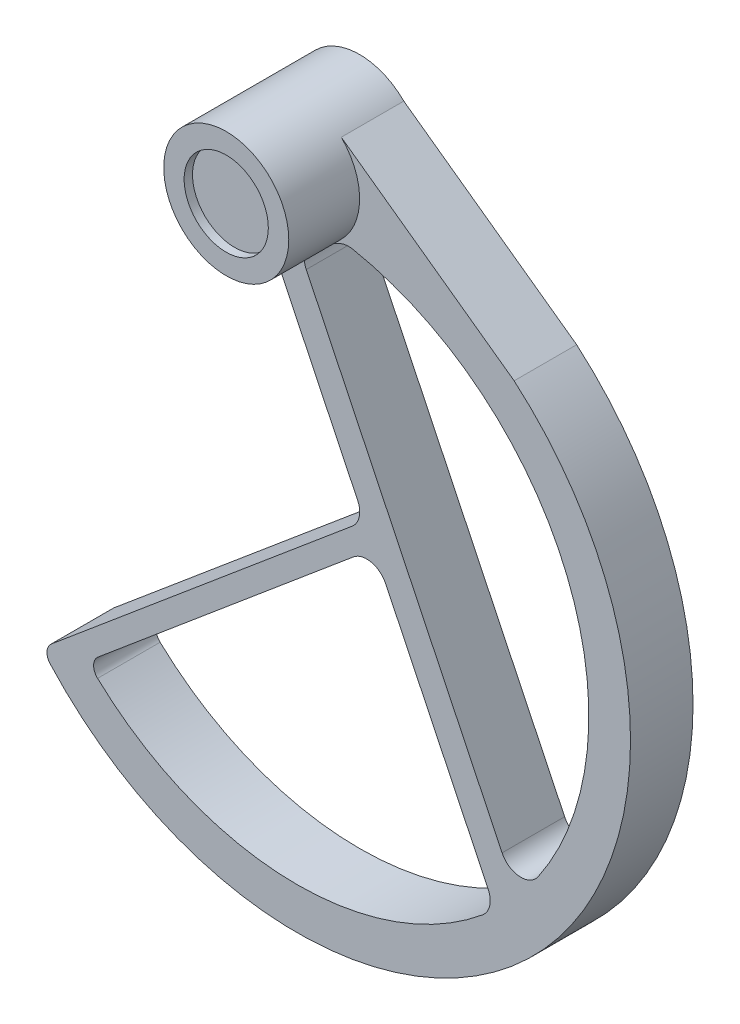
ISO-10303-21;
HEADER;
FILE_DESCRIPTION(('STEP AP214'),'2;1');
FILE_NAME('part.step','',(''),(''),'','','');
FILE_SCHEMA(('AUTOMOTIVE_DESIGN { 1 0 10303 214 1 1 1 1 }'));
ENDSEC;
DATA;
#1=APPLICATION_CONTEXT('core data for automotive mechanical design processes');
#2=APPLICATION_PROTOCOL_DEFINITION('international standard','automotive_design',2000,#1);
#3=PRODUCT_CONTEXT('',#1,'mechanical');
#4=PRODUCT('Part','Part','',(#3));
#5=PRODUCT_RELATED_PRODUCT_CATEGORY('part','',(#4));
#6=PRODUCT_DEFINITION_FORMATION('','',#4);
#7=PRODUCT_DEFINITION_CONTEXT('part definition',#1,'design');
#8=PRODUCT_DEFINITION('design','',#6,#7);
#9=PRODUCT_DEFINITION_SHAPE('','',#8);
#10=(LENGTH_UNIT() NAMED_UNIT(*) SI_UNIT(.MILLI.,.METRE.));
#11=(NAMED_UNIT(*) PLANE_ANGLE_UNIT() SI_UNIT($,.RADIAN.));
#12=(NAMED_UNIT(*) SI_UNIT($,.STERADIAN.) SOLID_ANGLE_UNIT());
#13=UNCERTAINTY_MEASURE_WITH_UNIT(LENGTH_MEASURE(1.E-05),#10,'distance_accuracy_value','');
#14=(GEOMETRIC_REPRESENTATION_CONTEXT(3) GLOBAL_UNCERTAINTY_ASSIGNED_CONTEXT((#13)) GLOBAL_UNIT_ASSIGNED_CONTEXT((#10,
#11,#12)) REPRESENTATION_CONTEXT('',''));
#15=CARTESIAN_POINT('',(0.,0.,0.));
#16=DIRECTION('',(0.,0.,1.));
#17=DIRECTION('',(1.,0.,0.));
#18=AXIS2_PLACEMENT_3D('',#15,#16,#17);
#19=CARTESIAN_POINT('',(-12.7570586950624,-6.1348621133076,15.));
#20=DIRECTION('',(0.901206602628173,0.433389731511241,0.));
#21=DIRECTION('',(-0.433389731511241,0.901206602628173,0.));
#22=AXIS2_PLACEMENT_3D('',#19,#20,#21);
#23=PLANE('',#22);
#24=DIRECTION('',(0.433389731511241,-0.901206602628173,0.));
#25=VECTOR('',#24,1.);
#26=CARTESIAN_POINT('',(-12.7570586950624,-6.1348621133076,0.));
#27=LINE('',#26,#25);
#28=CARTESIAN_POINT('',(21.2324006956412,-76.8137984043253,0.));
#29=VERTEX_POINT('',#28);
#30=CARTESIAN_POINT('',(45.844843506453,-127.9938203457,0.));
#31=VERTEX_POINT('',#30);
#32=EDGE_CURVE('E312',#29,#31,#27,.T.);
#33=ORIENTED_EDGE('',*,*,#32,.T.);
#34=DIRECTION('',(0.,0.,-1.));
#35=VECTOR('',#34,1.);
#36=CARTESIAN_POINT('',(45.844843506453,-127.9938203457,15.));
#37=LINE('',#36,#35);
#38=CARTESIAN_POINT('',(45.844843506453,-127.9938203457,15.));
#39=VERTEX_POINT('',#38);
#40=EDGE_CURVE('E197',#39,#31,#37,.T.);
#41=ORIENTED_EDGE('',*,*,#40,.F.);
#42=DIRECTION('',(0.433389731511241,-0.901206602628173,0.));
#43=VECTOR('',#42,1.);
#44=CARTESIAN_POINT('',(-12.7570586950624,-6.1348621133076,15.));
#45=LINE('',#44,#43);
#46=CARTESIAN_POINT('',(21.2324006956412,-76.8137984043253,15.));
#47=VERTEX_POINT('',#46);
#48=EDGE_CURVE('E280',#47,#39,#45,.T.);
#49=ORIENTED_EDGE('',*,*,#48,.F.);
#50=DIRECTION('',(0.,0.,-1.));
#51=VECTOR('',#50,1.);
#52=CARTESIAN_POINT('',(21.2324006956412,-76.8137984043253,15.));
#53=LINE('',#52,#51);
#54=EDGE_CURVE('E326',#47,#29,#53,.T.);
#55=ORIENTED_EDGE('',*,*,#54,.T.);
#56=EDGE_LOOP('',(#33,#41,#49,#55));
#57=FACE_BOUND('',#56,.T.);
#58=ADVANCED_FACE('F35',(#57),#23,.F.);
#59=CARTESIAN_POINT('',(41.3388104933121,-130.160769003256,15.));
#60=DIRECTION('',(0.,0.,-1.));
#61=DIRECTION('',(-1.,0.,0.));
#62=AXIS2_PLACEMENT_3D('',#59,#60,#61);
#63=CYLINDRICAL_SURFACE('',#62,4.99999999999999);
#64=CARTESIAN_POINT('',(41.3388104933121,-130.160769003256,0.));
#65=DIRECTION('',(0.,0.,1.));
#66=DIRECTION('',(1.,0.,0.));
#67=AXIS2_PLACEMENT_3D('',#64,#65,#66);
#68=CIRCLE('',#67,4.99999999999999);
#69=CARTESIAN_POINT('',(44.5187189927976,-134.019289695814,0.));
#70=VERTEX_POINT('',#69);
#71=EDGE_CURVE('E315',#31,#70,#68,.F.);
#72=ORIENTED_EDGE('',*,*,#71,.T.);
#73=DIRECTION('',(0.,0.,-1.));
#74=VECTOR('',#73,1.);
#75=CARTESIAN_POINT('',(44.5187189927976,-134.019289695814,15.));
#76=LINE('',#75,#74);
#77=CARTESIAN_POINT('',(44.5187189927976,-134.019289695814,15.));
#78=VERTEX_POINT('',#77);
#79=EDGE_CURVE('E200',#78,#70,#76,.T.);
#80=ORIENTED_EDGE('',*,*,#79,.F.);
#81=CARTESIAN_POINT('',(41.3388104933121,-130.160769003256,15.));
#82=DIRECTION('',(0.,0.,1.));
#83=DIRECTION('',(1.,0.,0.));
#84=AXIS2_PLACEMENT_3D('',#81,#82,#83);
#85=CIRCLE('',#84,4.99999999999999);
#86=EDGE_CURVE('E283',#39,#78,#85,.F.);
#87=ORIENTED_EDGE('',*,*,#86,.F.);
#88=ORIENTED_EDGE('',*,*,#40,.T.);
#89=EDGE_LOOP('',(#72,#80,#87,#88));
#90=FACE_BOUND('',#89,.T.);
#91=ADVANCED_FACE('F379',(#90),#63,.F.);
#92=CARTESIAN_POINT('',(0.,-80.,15.));
#93=DIRECTION('',(0.,0.,-1.));
#94=DIRECTION('',(-1.,0.,0.));
#95=AXIS2_PLACEMENT_3D('',#92,#93,#94);
#96=CYLINDRICAL_SURFACE('',#95,70.);
#97=CARTESIAN_POINT('',(0.,-80.,0.));
#98=DIRECTION('',(0.,0.,1.));
#99=DIRECTION('',(1.,0.,0.));
#100=AXIS2_PLACEMENT_3D('',#97,#98,#99);
#101=CIRCLE('',#100,70.);
#102=CARTESIAN_POINT('',(-47.870174388264,-131.072951785042,0.));
#103=VERTEX_POINT('',#102);
#104=EDGE_CURVE('E318',#103,#70,#101,.T.);
#105=ORIENTED_EDGE('',*,*,#104,.F.);
#106=DIRECTION('',(0.,0.,-1.));
#107=VECTOR('',#106,1.);
#108=CARTESIAN_POINT('',(-47.870174388264,-131.072951785042,15.));
#109=LINE('',#108,#107);
#110=CARTESIAN_POINT('',(-47.870174388264,-131.072951785042,15.));
#111=VERTEX_POINT('',#110);
#112=EDGE_CURVE('E335',#111,#103,#109,.T.);
#113=ORIENTED_EDGE('',*,*,#112,.F.);
#114=CARTESIAN_POINT('',(0.,-80.,15.));
#115=DIRECTION('',(0.,0.,1.));
#116=DIRECTION('',(1.,0.,0.));
#117=AXIS2_PLACEMENT_3D('',#114,#115,#116);
#118=CIRCLE('',#117,70.);
#119=EDGE_CURVE('E285',#111,#78,#118,.T.);
#120=ORIENTED_EDGE('',*,*,#119,.T.);
#121=ORIENTED_EDGE('',*,*,#79,.T.);
#122=EDGE_LOOP('',(#105,#113,#120,#121));
#123=FACE_BOUND('',#122,.T.);
#124=ADVANCED_FACE('F384',(#123),#96,.F.);
#125=CARTESIAN_POINT('',(-45.8185954859101,-128.884110994254,15.));
#126=DIRECTION('',(0.,0.,-1.));
#127=DIRECTION('',(-1.,0.,0.));
#128=AXIS2_PLACEMENT_3D('',#125,#126,#127);
#129=CYLINDRICAL_SURFACE('',#128,2.99999999999979);
#130=CARTESIAN_POINT('',(-45.8185954859101,-128.884110994254,0.));
#131=DIRECTION('',(0.,0.,1.));
#132=DIRECTION('',(1.,0.,0.));
#133=AXIS2_PLACEMENT_3D('',#130,#131,#132);
#134=CIRCLE('',#133,2.99999999999979);
#135=CARTESIAN_POINT('',(-47.7476784165524,-126.586582094174,0.));
#136=VERTEX_POINT('',#135);
#137=EDGE_CURVE('E321',#103,#136,#134,.F.);
#138=ORIENTED_EDGE('',*,*,#137,.T.);
#139=DIRECTION('',(0.,0.,-1.));
#140=VECTOR('',#139,1.);
#141=CARTESIAN_POINT('',(-47.7476784165524,-126.586582094174,15.));
#142=LINE('',#141,#140);
#143=CARTESIAN_POINT('',(-47.7476784165524,-126.586582094174,15.));
#144=VERTEX_POINT('',#143);
#145=EDGE_CURVE('E332',#144,#136,#142,.T.);
#146=ORIENTED_EDGE('',*,*,#145,.F.);
#147=CARTESIAN_POINT('',(-45.8185954859101,-128.884110994254,15.));
#148=DIRECTION('',(0.,0.,1.));
#149=DIRECTION('',(1.,0.,0.));
#150=AXIS2_PLACEMENT_3D('',#147,#148,#149);
#151=CIRCLE('',#150,2.99999999999979);
#152=EDGE_CURVE('E288',#111,#144,#151,.F.);
#153=ORIENTED_EDGE('',*,*,#152,.F.);
#154=ORIENTED_EDGE('',*,*,#112,.T.);
#155=EDGE_LOOP('',(#138,#146,#153,#154));
#156=FACE_BOUND('',#155,.T.);
#157=ADVANCED_FACE('F390',(#156),#129,.F.);
#158=CARTESIAN_POINT('',(42.5956727933285,-50.7312504333006,15.));
#159=DIRECTION('',(-0.643027643547508,0.765842966693394,0.));
#160=DIRECTION('',(-0.765842966693394,-0.643027643547508,0.));
#161=AXIS2_PLACEMENT_3D('',#158,#159,#160);
#162=PLANE('',#161);
#163=DIRECTION('',(0.765842966693394,0.643027643547508,0.));
#164=VECTOR('',#163,1.);
#165=CARTESIAN_POINT('',(42.5956727933285,-50.7312504333006,0.));
#166=LINE('',#165,#164);
#167=CARTESIAN_POINT('',(13.5112294647628,-75.1515322284145,0.));
#168=VERTEX_POINT('',#167);
#169=EDGE_CURVE('E323',#136,#168,#166,.T.);
#170=ORIENTED_EDGE('',*,*,#169,.T.);
#171=DIRECTION('',(0.,0.,-1.));
#172=VECTOR('',#171,1.);
#173=CARTESIAN_POINT('',(13.5112294647628,-75.1515322284145,15.));
#174=LINE('',#173,#172);
#175=CARTESIAN_POINT('',(13.5112294647628,-75.1515322284145,15.));
#176=VERTEX_POINT('',#175);
#177=EDGE_CURVE('E329',#176,#168,#174,.T.);
#178=ORIENTED_EDGE('',*,*,#177,.F.);
#179=DIRECTION('',(0.765842966693394,0.643027643547508,0.));
#180=VECTOR('',#179,1.);
#181=CARTESIAN_POINT('',(42.5956727933285,-50.7312504333006,15.));
#182=LINE('',#181,#180);
#183=EDGE_CURVE('E290',#144,#176,#182,.T.);
#184=ORIENTED_EDGE('',*,*,#183,.F.);
#185=ORIENTED_EDGE('',*,*,#145,.T.);
#186=EDGE_LOOP('',(#170,#178,#184,#185));
#187=FACE_BOUND('',#186,.T.);
#188=ADVANCED_FACE('F394',(#187),#162,.F.);
#189=CARTESIAN_POINT('',(10.0302471408598,-65.0565868768263,15.));
#190=DIRECTION('',(0.,0.,-1.));
#191=DIRECTION('',(-1.,0.,0.));
#192=AXIS2_PLACEMENT_3D('',#189,#190,#191);
#193=CYLINDRICAL_SURFACE('',#192,5.);
#194=CARTESIAN_POINT('',(10.0302471408598,-65.0565868768263,0.));
#195=DIRECTION('',(0.,0.,1.));
#196=DIRECTION('',(1.,0.,0.));
#197=AXIS2_PLACEMENT_3D('',#194,#195,#196);
#198=CIRCLE('',#197,5.);
#199=CARTESIAN_POINT('',(13.2441851892925,-68.8868090924212,0.));
#200=VERTEX_POINT('',#199);
#201=CARTESIAN_POINT('',(14.5362801540007,-62.8896382192701,0.));
#202=VERTEX_POINT('',#201);
#203=EDGE_CURVE('E258',#200,#202,#198,.T.);
#204=ORIENTED_EDGE('',*,*,#203,.F.);
#205=DIRECTION('',(0.,0.,-1.));
#206=VECTOR('',#205,1.);
#207=CARTESIAN_POINT('',(13.2441851892925,-68.8868090924212,15.));
#208=LINE('',#207,#206);
#209=CARTESIAN_POINT('',(13.2441851892925,-68.8868090924212,15.));
#210=VERTEX_POINT('',#209);
#211=EDGE_CURVE('E208',#210,#200,#208,.T.);
#212=ORIENTED_EDGE('',*,*,#211,.F.);
#213=CARTESIAN_POINT('',(10.0302471408598,-65.0565868768263,15.));
#214=DIRECTION('',(0.,0.,1.));
#215=DIRECTION('',(1.,0.,0.));
#216=AXIS2_PLACEMENT_3D('',#213,#214,#215);
#217=CIRCLE('',#216,5.);
#218=CARTESIAN_POINT('',(14.5362801540007,-62.8896382192701,15.));
#219=VERTEX_POINT('',#218);
#220=EDGE_CURVE('E269',#210,#219,#217,.T.);
#221=ORIENTED_EDGE('',*,*,#220,.T.);
#222=DIRECTION('',(0.,0.,-1.));
#223=VECTOR('',#222,1.);
#224=CARTESIAN_POINT('',(14.5362801540007,-62.8896382192701,15.));
#225=LINE('',#224,#223);
#226=EDGE_CURVE('E294',#219,#202,#225,.T.);
#227=ORIENTED_EDGE('',*,*,#226,.T.);
#228=EDGE_LOOP('',(#204,#212,#221,#227));
#229=FACE_BOUND('',#228,.T.);
#230=ADVANCED_FACE('F37',(#229),#193,.F.);
#231=CARTESIAN_POINT('',(39.3923101204882,-46.9459271066778,15.));
#232=DIRECTION('',(-0.642787609686534,0.766044443118983,0.));
#233=DIRECTION('',(-0.766044443118982,-0.642787609686534,0.));
#234=AXIS2_PLACEMENT_3D('',#231,#232,#233);
#235=PLANE('',#234);
#236=DIRECTION('',(0.766044443118982,0.642787609686534,0.));
#237=VECTOR('',#236,1.);
#238=CARTESIAN_POINT('',(39.3923101204882,-46.9459271066778,0.));
#239=LINE('',#238,#237);
#240=CARTESIAN_POINT('',(-58.9406362868111,-129.457066169617,0.));
#241=VERTEX_POINT('',#240);
#242=EDGE_CURVE('E297',#241,#200,#239,.T.);
#243=ORIENTED_EDGE('',*,*,#242,.F.);
#244=DIRECTION('',(0.,0.,-1.));
#245=VECTOR('',#244,1.);
#246=CARTESIAN_POINT('',(-58.9406362868111,-129.457066169617,15.));
#247=LINE('',#246,#245);
#248=CARTESIAN_POINT('',(-58.9406362868111,-129.457066169617,15.));
#249=VERTEX_POINT('',#248);
#250=EDGE_CURVE('E341',#249,#241,#247,.T.);
#251=ORIENTED_EDGE('',*,*,#250,.F.);
#252=DIRECTION('',(0.766044443118982,0.642787609686534,0.));
#253=VECTOR('',#252,1.);
#254=CARTESIAN_POINT('',(39.3923101204882,-46.9459271066778,15.));
#255=LINE('',#254,#253);
#256=EDGE_CURVE('E272',#249,#210,#255,.T.);
#257=ORIENTED_EDGE('',*,*,#256,.T.);
#258=ORIENTED_EDGE('',*,*,#211,.T.);
#259=EDGE_LOOP('',(#243,#251,#257,#258));
#260=FACE_BOUND('',#259,.T.);
#261=ADVANCED_FACE('F347',(#260),#235,.T.);
#262=CARTESIAN_POINT('',(-57.0122734577518,-131.755199498973,15.));
#263=DIRECTION('',(0.,0.,-1.));
#264=DIRECTION('',(-1.,0.,0.));
#265=AXIS2_PLACEMENT_3D('',#262,#263,#264);
#266=CYLINDRICAL_SURFACE('',#265,2.99999999999976);
#267=CARTESIAN_POINT('',(-57.0122734577518,-131.755199498973,0.));
#268=DIRECTION('',(0.,0.,1.));
#269=DIRECTION('',(1.,0.,0.));
#270=AXIS2_PLACEMENT_3D('',#267,#268,#269);
#271=CIRCLE('',#270,2.99999999999976);
#272=CARTESIAN_POINT('',(-59.2335308651964,-133.771635843089,0.));
#273=VERTEX_POINT('',#272);
#274=EDGE_CURVE('E300',#273,#241,#271,.F.);
#275=ORIENTED_EDGE('',*,*,#274,.F.);
#276=DIRECTION('',(0.,0.,-1.));
#277=VECTOR('',#276,1.);
#278=CARTESIAN_POINT('',(-59.2335308651964,-133.771635843089,15.));
#279=LINE('',#278,#277);
#280=CARTESIAN_POINT('',(-59.2335308651964,-133.771635843089,15.));
#281=VERTEX_POINT('',#280);
#282=EDGE_CURVE('E340',#281,#273,#279,.T.);
#283=ORIENTED_EDGE('',*,*,#282,.F.);
#284=CARTESIAN_POINT('',(-57.0122734577518,-131.755199498973,15.));
#285=DIRECTION('',(0.,0.,1.));
#286=DIRECTION('',(1.,0.,0.));
#287=AXIS2_PLACEMENT_3D('',#284,#285,#286);
#288=CIRCLE('',#287,2.99999999999976);
#289=EDGE_CURVE('E276',#281,#249,#288,.F.);
#290=ORIENTED_EDGE('',*,*,#289,.T.);
#291=ORIENTED_EDGE('',*,*,#250,.T.);
#292=EDGE_LOOP('',(#275,#283,#290,#291));
#293=FACE_BOUND('',#292,.T.);
#294=ADVANCED_FACE('F357',(#293),#266,.T.);
#295=CARTESIAN_POINT('',(0.,-80.,15.));
#296=DIRECTION('',(0.,0.,-1.));
#297=DIRECTION('',(-1.,0.,0.));
#298=AXIS2_PLACEMENT_3D('',#295,#296,#297);
#299=CYLINDRICAL_SURFACE('',#298,80.);
#300=CARTESIAN_POINT('',(0.,-80.,0.));
#301=DIRECTION('',(0.,0.,1.));
#302=DIRECTION('',(1.,0.,0.));
#303=AXIS2_PLACEMENT_3D('',#300,#301,#302);
#304=CIRCLE('',#303,80.);
#305=CARTESIAN_POINT('',(52.0761789176773,-19.2705047828153,0.));
#306=VERTEX_POINT('',#305);
#307=EDGE_CURVE('E303',#273,#306,#304,.T.);
#308=ORIENTED_EDGE('',*,*,#307,.T.);
#309=DIRECTION('',(0.,0.,-1.));
#310=VECTOR('',#309,1.);
#311=CARTESIAN_POINT('',(52.0761789176773,-19.2705047828153,15.));
#312=LINE('',#311,#310);
#313=CARTESIAN_POINT('',(52.0761789176773,-19.2705047828153,15.));
#314=VERTEX_POINT('',#313);
#315=EDGE_CURVE('E189',#314,#306,#312,.T.);
#316=ORIENTED_EDGE('',*,*,#315,.F.);
#317=CARTESIAN_POINT('',(0.,-80.,15.));
#318=DIRECTION('',(0.,0.,1.));
#319=DIRECTION('',(1.,0.,0.));
#320=AXIS2_PLACEMENT_3D('',#317,#318,#319);
#321=CIRCLE('',#320,80.);
#322=EDGE_CURVE('E177',#281,#314,#321,.T.);
#323=ORIENTED_EDGE('',*,*,#322,.F.);
#324=ORIENTED_EDGE('',*,*,#282,.T.);
#325=EDGE_LOOP('',(#308,#316,#323,#324));
#326=FACE_BOUND('',#325,.T.);
#327=ADVANCED_FACE('F359',(#326),#299,.T.);
#328=CARTESIAN_POINT('',(8.65474635415258,12.0128323695446,15.));
#329=DIRECTION('',(0.584549661802916,0.811357931424902,0.));
#330=DIRECTION('',(-0.811357931424902,0.584549661802916,0.));
#331=AXIS2_PLACEMENT_3D('',#328,#329,#330);
#332=PLANE('',#331);
#333=DIRECTION('',(0.811357931424902,-0.584549661802916,0.));
#334=VECTOR('',#333,1.);
#335=CARTESIAN_POINT('',(8.65474635415258,12.0128323695446,0.));
#336=LINE('',#335,#334);
#337=CARTESIAN_POINT('',(10.6066017177981,10.6066017177983,0.));
#338=VERTEX_POINT('',#337);
#339=EDGE_CURVE('E186',#338,#306,#336,.T.);
#340=ORIENTED_EDGE('',*,*,#339,.F.);
#341=DIRECTION('',(0.,0.,-1.));
#342=VECTOR('',#341,1.);
#343=CARTESIAN_POINT('',(10.6066017177981,10.6066017177983,15.));
#344=LINE('',#343,#342);
#345=CARTESIAN_POINT('',(10.6066017177981,10.6066017177983,15.));
#346=VERTEX_POINT('',#345);
#347=EDGE_CURVE('E183',#346,#338,#344,.T.);
#348=ORIENTED_EDGE('',*,*,#347,.F.);
#349=DIRECTION('',(0.811357931424902,-0.584549661802916,0.));
#350=VECTOR('',#349,1.);
#351=CARTESIAN_POINT('',(8.65474635415258,12.0128323695446,15.));
#352=LINE('',#351,#350);
#353=EDGE_CURVE('E171',#346,#314,#352,.T.);
#354=ORIENTED_EDGE('',*,*,#353,.T.);
#355=ORIENTED_EDGE('',*,*,#315,.T.);
#356=EDGE_LOOP('',(#340,#348,#354,#355));
#357=FACE_BOUND('',#356,.T.);
#358=ADVANCED_FACE('F184',(#357),#332,.T.);
#359=CARTESIAN_POINT('',(0.,0.,15.));
#360=DIRECTION('',(0.,0.,-1.));
#361=DIRECTION('',(-1.,0.,0.));
#362=AXIS2_PLACEMENT_3D('',#359,#360,#361);
#363=CYLINDRICAL_SURFACE('',#362,15.);
#364=CARTESIAN_POINT('',(0.,0.,0.));
#365=DIRECTION('',(0.,0.,1.));
#366=DIRECTION('',(1.,0.,0.));
#367=AXIS2_PLACEMENT_3D('',#364,#365,#366);
#368=CIRCLE('',#367,15.);
#369=CARTESIAN_POINT('',(-10.6066017177981,-10.6066017177983,0.));
#370=VERTEX_POINT('',#369);
#371=EDGE_CURVE('E307',#338,#370,#368,.T.);
#372=ORIENTED_EDGE('',*,*,#371,.T.);
#373=DIRECTION('',(0.,0.,-1.));
#374=VECTOR('',#373,1.);
#375=CARTESIAN_POINT('',(-10.6066017177981,-10.6066017177983,15.));
#376=LINE('',#375,#374);
#377=CARTESIAN_POINT('',(-10.6066017177981,-10.6066017177983,15.));
#378=VERTEX_POINT('',#377);
#379=EDGE_CURVE('E190',#378,#370,#376,.T.);
#380=ORIENTED_EDGE('',*,*,#379,.F.);
#381=CARTESIAN_POINT('',(0.,0.,15.));
#382=DIRECTION('',(0.,0.,1.));
#383=DIRECTION('',(1.,0.,0.));
#384=AXIS2_PLACEMENT_3D('',#381,#382,#383);
#385=CIRCLE('',#384,15.);
#386=CARTESIAN_POINT('',(5.49416198956529,-13.9575851791209,15.));
#387=VERTEX_POINT('',#386);
#388=EDGE_CURVE('E11',#378,#387,#385,.T.);
#389=ORIENTED_EDGE('',*,*,#388,.T.);
#390=CARTESIAN_POINT('',(7.47266922099551,-13.0061222012399,15.));
#391=VERTEX_POINT('',#390);
#392=EDGE_CURVE('E196',#387,#391,#385,.T.);
#393=ORIENTED_EDGE('',*,*,#392,.T.);
#394=EDGE_CURVE('E44',#391,#346,#385,.T.);
#395=ORIENTED_EDGE('',*,*,#394,.T.);
#396=ORIENTED_EDGE('',*,*,#347,.T.);
#397=EDGE_LOOP('',(#372,#380,#389,#393,#395,#396));
#398=FACE_BOUND('',#397,.T.);
#399=CARTESIAN_POINT('',(0.,0.,32.));
#400=DIRECTION('',(0.,0.,1.));
#401=DIRECTION('',(1.,0.,0.));
#402=AXIS2_PLACEMENT_3D('',#399,#400,#401);
#403=CIRCLE('',#402,15.);
#404=CARTESIAN_POINT('',(15.,0.,32.));
#405=VERTEX_POINT('',#404);
#406=EDGE_CURVE('E216',#405,#405,#403,.T.);
#407=ORIENTED_EDGE('',*,*,#406,.F.);
#408=EDGE_LOOP('',(#407));
#409=FACE_BOUND('',#408,.T.);
#410=ADVANCED_FACE('F193',(#398,#409),#363,.T.);
#411=CARTESIAN_POINT('',(-12.7570586950624,-6.13486211330761,15.));
#412=DIRECTION('',(0.901206602628173,0.433389731511242,0.));
#413=DIRECTION('',(-0.433389731511242,0.901206602628173,0.));
#414=AXIS2_PLACEMENT_3D('',#411,#412,#413);
#415=PLANE('',#414);
#416=DIRECTION('',(0.433389731511242,-0.901206602628173,0.));
#417=VECTOR('',#416,1.);
#418=CARTESIAN_POINT('',(-12.7570586950624,-6.13486211330761,0.));
#419=LINE('',#418,#417);
#420=EDGE_CURVE('E309',#370,#202,#419,.T.);
#421=ORIENTED_EDGE('',*,*,#420,.T.);
#422=ORIENTED_EDGE('',*,*,#226,.F.);
#423=DIRECTION('',(0.433389731511242,-0.901206602628173,0.));
#424=VECTOR('',#423,1.);
#425=CARTESIAN_POINT('',(-12.7570586950624,-6.13486211330761,15.));
#426=LINE('',#425,#424);
#427=EDGE_CURVE('E180',#378,#219,#426,.T.);
#428=ORIENTED_EDGE('',*,*,#427,.F.);
#429=ORIENTED_EDGE('',*,*,#379,.T.);
#430=EDGE_LOOP('',(#421,#422,#428,#429));
#431=FACE_BOUND('',#430,.T.);
#432=ADVANCED_FACE('F364',(#431),#415,.F.);
#433=CARTESIAN_POINT('',(16.7263676825004,-78.9807470618814,15.));
#434=DIRECTION('',(0.,0.,-1.));
#435=DIRECTION('',(-1.,0.,0.));
#436=AXIS2_PLACEMENT_3D('',#433,#434,#435);
#437=CYLINDRICAL_SURFACE('',#436,5.);
#438=CARTESIAN_POINT('',(16.7263676825004,-78.9807470618814,0.));
#439=DIRECTION('',(0.,0.,1.));
#440=DIRECTION('',(1.,0.,0.));
#441=AXIS2_PLACEMENT_3D('',#438,#439,#440);
#442=CIRCLE('',#441,5.);
#443=EDGE_CURVE('E273',#168,#29,#442,.F.);
#444=ORIENTED_EDGE('',*,*,#443,.T.);
#445=ORIENTED_EDGE('',*,*,#54,.F.);
#446=CARTESIAN_POINT('',(16.7263676825004,-78.9807470618814,15.));
#447=DIRECTION('',(0.,0.,1.));
#448=DIRECTION('',(1.,0.,0.));
#449=AXIS2_PLACEMENT_3D('',#446,#447,#448);
#450=CIRCLE('',#449,5.);
#451=EDGE_CURVE('E292',#176,#47,#450,.F.);
#452=ORIENTED_EDGE('',*,*,#451,.F.);
#453=ORIENTED_EDGE('',*,*,#177,.T.);
#454=EDGE_LOOP('',(#444,#445,#452,#453));
#455=FACE_BOUND('',#454,.T.);
#456=ADVANCED_FACE('F368',(#455),#437,.F.);
#457=CARTESIAN_POINT('',(0.,0.,15.));
#458=DIRECTION('',(0.,0.,1.));
#459=DIRECTION('',(1.,0.,0.));
#460=AXIS2_PLACEMENT_3D('',#457,#458,#459);
#461=PLANE('',#460);
#462=ORIENTED_EDGE('',*,*,#388,.F.);
#463=ORIENTED_EDGE('',*,*,#427,.T.);
#464=ORIENTED_EDGE('',*,*,#220,.F.);
#465=ORIENTED_EDGE('',*,*,#256,.F.);
#466=ORIENTED_EDGE('',*,*,#289,.F.);
#467=ORIENTED_EDGE('',*,*,#322,.T.);
#468=ORIENTED_EDGE('',*,*,#353,.F.);
#469=ORIENTED_EDGE('',*,*,#394,.F.);
#470=DIRECTION('',(-0.901206602628171,-0.433389731511247,0.));
#471=VECTOR('',#470,1.);
#472=CARTESIAN_POINT('',(6.4834156052804,-13.4818536901804,15.));
#473=LINE('',#472,#471);
#474=CARTESIAN_POINT('',(10.2196588467731,-11.6850964864837,15.));
#475=VERTEX_POINT('',#474);
#476=EDGE_CURVE('E223',#475,#391,#473,.T.);
#477=ORIENTED_EDGE('',*,*,#476,.F.);
#478=CARTESIAN_POINT('',(12.3866075043293,-16.1911294996245,15.));
#479=DIRECTION('',(0.,0.,1.));
#480=DIRECTION('',(1.,0.,0.));
#481=AXIS2_PLACEMENT_3D('',#478,#479,#480);
#482=CIRCLE('',#481,5.);
#483=CARTESIAN_POINT('',(13.3394234662008,-11.2827548457495,15.));
#484=VERTEX_POINT('',#483);
#485=EDGE_CURVE('E250',#484,#475,#482,.T.);
#486=ORIENTED_EDGE('',*,*,#485,.F.);
#487=CARTESIAN_POINT('',(0.,-80.,15.));
#488=DIRECTION('',(0.,0.,1.));
#489=DIRECTION('',(1.,0.,0.));
#490=AXIS2_PLACEMENT_3D('',#487,#488,#489);
#491=CIRCLE('',#490,69.9999999999999);
#492=CARTESIAN_POINT('',(57.8260553336624,-119.448033215209,15.));
#493=VERTEX_POINT('',#492);
#494=EDGE_CURVE('E247',#493,#484,#491,.T.);
#495=ORIENTED_EDGE('',*,*,#494,.F.);
#496=CARTESIAN_POINT('',(53.6956228098294,-116.63031655698,15.));
#497=DIRECTION('',(0.,0.,1.));
#498=DIRECTION('',(-1.,0.,0.));
#499=AXIS2_PLACEMENT_3D('',#496,#497,#498);
#500=CIRCLE('',#499,5.);
#501=CARTESIAN_POINT('',(49.1895897966885,-118.797265214536,15.));
#502=VERTEX_POINT('',#501);
#503=EDGE_CURVE('E244',#502,#493,#500,.T.);
#504=ORIENTED_EDGE('',*,*,#503,.F.);
#505=DIRECTION('',(0.433389731511244,-0.901206602628172,0.));
#506=VECTOR('',#505,1.);
#507=CARTESIAN_POINT('',(49.1895897966885,-118.797265214536,15.));
#508=LINE('',#507,#506);
#509=CARTESIAN_POINT('',(2.20175178617109,-21.0890206960504,15.));
#510=VERTEX_POINT('',#509);
#511=EDGE_CURVE('E241',#510,#502,#508,.T.);
#512=ORIENTED_EDGE('',*,*,#511,.F.);
#513=CARTESIAN_POINT('',(6.70778479931193,-18.9220720384942,15.));
#514=DIRECTION('',(0.,0.,1.));
#515=DIRECTION('',(-1.,0.,0.));
#516=AXIS2_PLACEMENT_3D('',#513,#514,#515);
#517=CIRCLE('',#516,5.);
#518=CARTESIAN_POINT('',(4.54083614175573,-14.4160390253533,15.));
#519=VERTEX_POINT('',#518);
#520=EDGE_CURVE('E239',#519,#510,#517,.T.);
#521=ORIENTED_EDGE('',*,*,#520,.F.);
#522=EDGE_CURVE('E52',#387,#519,#473,.T.);
#523=ORIENTED_EDGE('',*,*,#522,.F.);
#524=EDGE_LOOP('',(#462,#463,#464,#465,#466,#467,#468,#469,#477,#486,#495,#504,#512,#521,#523));
#525=FACE_BOUND('',#524,.T.);
#526=ORIENTED_EDGE('',*,*,#48,.T.);
#527=ORIENTED_EDGE('',*,*,#86,.T.);
#528=ORIENTED_EDGE('',*,*,#119,.F.);
#529=ORIENTED_EDGE('',*,*,#152,.T.);
#530=ORIENTED_EDGE('',*,*,#183,.T.);
#531=ORIENTED_EDGE('',*,*,#451,.T.);
#532=EDGE_LOOP('',(#526,#527,#528,#529,#530,#531));
#533=FACE_BOUND('',#532,.T.);
#534=ADVANCED_FACE('F173',(#525,#533),#461,.T.);
#535=CARTESIAN_POINT('',(0.,0.,0.));
#536=DIRECTION('',(0.,0.,1.));
#537=DIRECTION('',(1.,0.,0.));
#538=AXIS2_PLACEMENT_3D('',#535,#536,#537);
#539=PLANE('',#538);
#540=DIRECTION('',(-0.90120660262817,-0.433389731511248,0.));
#541=VECTOR('',#540,1.);
#542=CARTESIAN_POINT('',(6.4834156052804,-13.4818536901804,0.));
#543=LINE('',#542,#541);
#544=CARTESIAN_POINT('',(10.2196588467731,-11.6850964864837,0.));
#545=VERTEX_POINT('',#544);
#546=CARTESIAN_POINT('',(4.54083614175573,-14.4160390253533,0.));
#547=VERTEX_POINT('',#546);
#548=EDGE_CURVE('E235',#545,#547,#543,.T.);
#549=ORIENTED_EDGE('',*,*,#548,.T.);
#550=CARTESIAN_POINT('',(6.70778479931193,-18.9220720384942,0.));
#551=DIRECTION('',(0.,0.,1.));
#552=DIRECTION('',(-1.,0.,0.));
#553=AXIS2_PLACEMENT_3D('',#550,#551,#552);
#554=CIRCLE('',#553,5.);
#555=CARTESIAN_POINT('',(2.20175178617109,-21.0890206960504,0.));
#556=VERTEX_POINT('',#555);
#557=EDGE_CURVE('E219',#547,#556,#554,.T.);
#558=ORIENTED_EDGE('',*,*,#557,.T.);
#559=DIRECTION('',(0.433389731511244,-0.901206602628172,0.));
#560=VECTOR('',#559,1.);
#561=CARTESIAN_POINT('',(49.1895897966885,-118.797265214536,0.));
#562=LINE('',#561,#560);
#563=CARTESIAN_POINT('',(49.1895897966885,-118.797265214536,0.));
#564=VERTEX_POINT('',#563);
#565=EDGE_CURVE('E222',#556,#564,#562,.T.);
#566=ORIENTED_EDGE('',*,*,#565,.T.);
#567=CARTESIAN_POINT('',(53.6956228098294,-116.63031655698,0.));
#568=DIRECTION('',(0.,0.,1.));
#569=DIRECTION('',(-1.,0.,0.));
#570=AXIS2_PLACEMENT_3D('',#567,#568,#569);
#571=CIRCLE('',#570,5.);
#572=CARTESIAN_POINT('',(57.8260553336624,-119.448033215209,0.));
#573=VERTEX_POINT('',#572);
#574=EDGE_CURVE('E226',#564,#573,#571,.T.);
#575=ORIENTED_EDGE('',*,*,#574,.T.);
#576=CARTESIAN_POINT('',(0.,-80.,0.));
#577=DIRECTION('',(0.,0.,1.));
#578=DIRECTION('',(1.,0.,0.));
#579=AXIS2_PLACEMENT_3D('',#576,#577,#578);
#580=CIRCLE('',#579,69.9999999999999);
#581=CARTESIAN_POINT('',(13.3394234662008,-11.2827548457495,0.));
#582=VERTEX_POINT('',#581);
#583=EDGE_CURVE('E229',#573,#582,#580,.T.);
#584=ORIENTED_EDGE('',*,*,#583,.T.);
#585=CARTESIAN_POINT('',(12.3866075043293,-16.1911294996245,0.));
#586=DIRECTION('',(0.,0.,1.));
#587=DIRECTION('',(1.,0.,0.));
#588=AXIS2_PLACEMENT_3D('',#585,#586,#587);
#589=CIRCLE('',#588,5.);
#590=EDGE_CURVE('E232',#582,#545,#589,.T.);
#591=ORIENTED_EDGE('',*,*,#590,.T.);
#592=EDGE_LOOP('',(#549,#558,#566,#575,#584,#591));
#593=FACE_BOUND('',#592,.T.);
#594=ORIENTED_EDGE('',*,*,#203,.T.);
#595=ORIENTED_EDGE('',*,*,#420,.F.);
#596=ORIENTED_EDGE('',*,*,#371,.F.);
#597=ORIENTED_EDGE('',*,*,#339,.T.);
#598=ORIENTED_EDGE('',*,*,#307,.F.);
#599=ORIENTED_EDGE('',*,*,#274,.T.);
#600=ORIENTED_EDGE('',*,*,#242,.T.);
#601=EDGE_LOOP('',(#594,#595,#596,#597,#598,#599,#600));
#602=FACE_BOUND('',#601,.T.);
#603=ORIENTED_EDGE('',*,*,#32,.F.);
#604=ORIENTED_EDGE('',*,*,#443,.F.);
#605=ORIENTED_EDGE('',*,*,#169,.F.);
#606=ORIENTED_EDGE('',*,*,#137,.F.);
#607=ORIENTED_EDGE('',*,*,#104,.T.);
#608=ORIENTED_EDGE('',*,*,#71,.F.);
#609=EDGE_LOOP('',(#603,#604,#605,#606,#607,#608));
#610=FACE_BOUND('',#609,.T.);
#611=ADVANCED_FACE('F354',(#593,#602,#610),#539,.F.);
#612=CARTESIAN_POINT('',(6.70778479931193,-18.9220720384942,0.));
#613=DIRECTION('',(0.,0.,1.));
#614=DIRECTION('',(1.,0.,0.));
#615=AXIS2_PLACEMENT_3D('',#612,#613,#614);
#616=CYLINDRICAL_SURFACE('',#615,5.);
#617=ORIENTED_EDGE('',*,*,#520,.T.);
#618=DIRECTION('',(0.,0.,1.));
#619=VECTOR('',#618,1.);
#620=CARTESIAN_POINT('',(2.20175178617109,-21.0890206960504,0.));
#621=LINE('',#620,#619);
#622=EDGE_CURVE('E238',#556,#510,#621,.T.);
#623=ORIENTED_EDGE('',*,*,#622,.F.);
#624=ORIENTED_EDGE('',*,*,#557,.F.);
#625=DIRECTION('',(0.,0.,1.));
#626=VECTOR('',#625,1.);
#627=CARTESIAN_POINT('',(4.54083614175573,-14.4160390253533,0.));
#628=LINE('',#627,#626);
#629=EDGE_CURVE('E255',#547,#519,#628,.T.);
#630=ORIENTED_EDGE('',*,*,#629,.T.);
#631=EDGE_LOOP('',(#617,#623,#624,#630));
#632=FACE_BOUND('',#631,.T.);
#633=ADVANCED_FACE('F401',(#632),#616,.F.);
#634=CARTESIAN_POINT('',(6.4834156052804,-13.4818536901804,0.));
#635=DIRECTION('',(-0.433389731511247,0.901206602628171,0.));
#636=DIRECTION('',(-0.901206602628171,-0.433389731511247,0.));
#637=AXIS2_PLACEMENT_3D('',#634,#635,#636);
#638=PLANE('',#637);
#639=ORIENTED_EDGE('',*,*,#476,.T.);
#640=EDGE_CURVE('E254',#391,#387,#473,.T.);
#641=ORIENTED_EDGE('',*,*,#640,.T.);
#642=ORIENTED_EDGE('',*,*,#522,.T.);
#643=ORIENTED_EDGE('',*,*,#629,.F.);
#644=ORIENTED_EDGE('',*,*,#548,.F.);
#645=DIRECTION('',(0.,0.,1.));
#646=VECTOR('',#645,1.);
#647=CARTESIAN_POINT('',(10.2196588467731,-11.6850964864837,0.));
#648=LINE('',#647,#646);
#649=EDGE_CURVE('E259',#545,#475,#648,.T.);
#650=ORIENTED_EDGE('',*,*,#649,.T.);
#651=EDGE_LOOP('',(#639,#641,#642,#643,#644,#650));
#652=FACE_BOUND('',#651,.T.);
#653=ADVANCED_FACE('F407',(#652),#638,.F.);
#654=CARTESIAN_POINT('',(12.3866075043293,-16.1911294996245,0.));
#655=DIRECTION('',(0.,0.,1.));
#656=DIRECTION('',(1.,0.,0.));
#657=AXIS2_PLACEMENT_3D('',#654,#655,#656);
#658=CYLINDRICAL_SURFACE('',#657,5.);
#659=ORIENTED_EDGE('',*,*,#485,.T.);
#660=ORIENTED_EDGE('',*,*,#649,.F.);
#661=ORIENTED_EDGE('',*,*,#590,.F.);
#662=DIRECTION('',(0.,0.,1.));
#663=VECTOR('',#662,1.);
#664=CARTESIAN_POINT('',(13.3394234662008,-11.2827548457495,0.));
#665=LINE('',#664,#663);
#666=EDGE_CURVE('E261',#582,#484,#665,.T.);
#667=ORIENTED_EDGE('',*,*,#666,.T.);
#668=EDGE_LOOP('',(#659,#660,#661,#667));
#669=FACE_BOUND('',#668,.T.);
#670=ADVANCED_FACE('F421',(#669),#658,.F.);
#671=CARTESIAN_POINT('',(0.,-80.,0.));
#672=DIRECTION('',(0.,0.,1.));
#673=DIRECTION('',(1.,0.,0.));
#674=AXIS2_PLACEMENT_3D('',#671,#672,#673);
#675=CYLINDRICAL_SURFACE('',#674,69.9999999999999);
#676=ORIENTED_EDGE('',*,*,#494,.T.);
#677=ORIENTED_EDGE('',*,*,#666,.F.);
#678=ORIENTED_EDGE('',*,*,#583,.F.);
#679=DIRECTION('',(0.,0.,1.));
#680=VECTOR('',#679,1.);
#681=CARTESIAN_POINT('',(57.8260553336624,-119.448033215209,0.));
#682=LINE('',#681,#680);
#683=EDGE_CURVE('E263',#573,#493,#682,.T.);
#684=ORIENTED_EDGE('',*,*,#683,.T.);
#685=EDGE_LOOP('',(#676,#677,#678,#684));
#686=FACE_BOUND('',#685,.T.);
#687=ADVANCED_FACE('F417',(#686),#675,.F.);
#688=CARTESIAN_POINT('',(53.6956228098294,-116.63031655698,0.));
#689=DIRECTION('',(0.,0.,1.));
#690=DIRECTION('',(1.,0.,0.));
#691=AXIS2_PLACEMENT_3D('',#688,#689,#690);
#692=CYLINDRICAL_SURFACE('',#691,5.);
#693=ORIENTED_EDGE('',*,*,#503,.T.);
#694=ORIENTED_EDGE('',*,*,#683,.F.);
#695=ORIENTED_EDGE('',*,*,#574,.F.);
#696=DIRECTION('',(0.,0.,1.));
#697=VECTOR('',#696,1.);
#698=CARTESIAN_POINT('',(49.1895897966885,-118.797265214536,0.));
#699=LINE('',#698,#697);
#700=EDGE_CURVE('E265',#564,#502,#699,.T.);
#701=ORIENTED_EDGE('',*,*,#700,.T.);
#702=EDGE_LOOP('',(#693,#694,#695,#701));
#703=FACE_BOUND('',#702,.T.);
#704=ADVANCED_FACE('F413',(#703),#692,.F.);
#705=CARTESIAN_POINT('',(49.1895897966885,-118.797265214536,0.));
#706=DIRECTION('',(-0.901206602628172,-0.433389731511244,0.));
#707=DIRECTION('',(0.433389731511244,-0.901206602628172,0.));
#708=AXIS2_PLACEMENT_3D('',#705,#706,#707);
#709=PLANE('',#708);
#710=ORIENTED_EDGE('',*,*,#511,.T.);
#711=ORIENTED_EDGE('',*,*,#700,.F.);
#712=ORIENTED_EDGE('',*,*,#565,.F.);
#713=ORIENTED_EDGE('',*,*,#622,.T.);
#714=EDGE_LOOP('',(#710,#711,#712,#713));
#715=FACE_BOUND('',#714,.T.);
#716=ADVANCED_FACE('F409',(#715),#709,.F.);
#717=CARTESIAN_POINT('',(0.,0.,32.));
#718=DIRECTION('',(0.,0.,1.));
#719=DIRECTION('',(1.,0.,0.));
#720=AXIS2_PLACEMENT_3D('',#717,#718,#719);
#721=PLANE('',#720);
#722=CARTESIAN_POINT('',(0.,0.,32.));
#723=DIRECTION('',(0.,0.,1.));
#724=DIRECTION('',(1.,0.,0.));
#725=AXIS2_PLACEMENT_3D('',#722,#723,#724);
#726=CIRCLE('',#725,10.1);
#727=CARTESIAN_POINT('',(10.1,0.,32.));
#728=VERTEX_POINT('',#727);
#729=EDGE_CURVE('E447',#728,#728,#726,.T.);
#730=ORIENTED_EDGE('',*,*,#729,.F.);
#731=EDGE_LOOP('',(#730));
#732=FACE_BOUND('',#731,.T.);
#733=ORIENTED_EDGE('',*,*,#406,.T.);
#734=EDGE_LOOP('',(#733));
#735=FACE_BOUND('',#734,.T.);
#736=ADVANCED_FACE('F412',(#732,#735),#721,.T.);
#737=CARTESIAN_POINT('',(0.,0.,15.));
#738=DIRECTION('',(0.,0.,1.));
#739=DIRECTION('',(1.,0.,0.));
#740=AXIS2_PLACEMENT_3D('',#737,#738,#739);
#741=PLANE('',#740);
#742=ORIENTED_EDGE('',*,*,#640,.F.);
#743=ORIENTED_EDGE('',*,*,#392,.F.);
#744=EDGE_LOOP('',(#742,#743));
#745=FACE_BOUND('',#744,.T.);
#746=ADVANCED_FACE('F429',(#745),#741,.F.);
#747=CARTESIAN_POINT('',(0.,0.,30.));
#748=DIRECTION('',(0.,0.,1.));
#749=DIRECTION('',(1.,0.,0.));
#750=AXIS2_PLACEMENT_3D('',#747,#748,#749);
#751=CYLINDRICAL_SURFACE('',#750,10.1);
#752=CARTESIAN_POINT('',(0.,0.,30.));
#753=DIRECTION('',(0.,0.,1.));
#754=DIRECTION('',(1.,0.,0.));
#755=AXIS2_PLACEMENT_3D('',#752,#753,#754);
#756=CIRCLE('',#755,10.1);
#757=CARTESIAN_POINT('',(10.1,0.,30.));
#758=VERTEX_POINT('',#757);
#759=EDGE_CURVE('E217',#758,#758,#756,.T.);
#760=ORIENTED_EDGE('',*,*,#759,.F.);
#761=EDGE_LOOP('',(#760));
#762=FACE_BOUND('',#761,.T.);
#763=ORIENTED_EDGE('',*,*,#729,.T.);
#764=EDGE_LOOP('',(#763));
#765=FACE_BOUND('',#764,.T.);
#766=ADVANCED_FACE('F432',(#762,#765),#751,.F.);
#767=CARTESIAN_POINT('',(0.,0.,30.));
#768=DIRECTION('',(0.,0.,1.));
#769=DIRECTION('',(1.,0.,0.));
#770=AXIS2_PLACEMENT_3D('',#767,#768,#769);
#771=PLANE('',#770);
#772=ORIENTED_EDGE('',*,*,#759,.T.);
#773=EDGE_LOOP('',(#772));
#774=FACE_BOUND('',#773,.T.);
#775=ADVANCED_FACE('F439',(#774),#771,.T.);
#776=CLOSED_SHELL('',(#58,#91,#124,#157,#188,#230,#261,#294,#327,#358,#410,#432,#456,#534,#611,
#633,#653,#670,#687,#704,#716,#736,#746,#766,#775));
#777=MANIFOLD_SOLID_BREP('B2',#776);
#778=ADVANCED_BREP_SHAPE_REPRESENTATION('',(#18,#777),#14);
#779=SHAPE_DEFINITION_REPRESENTATION(#9,#778);
ENDSEC;
END-ISO-10303-21;
